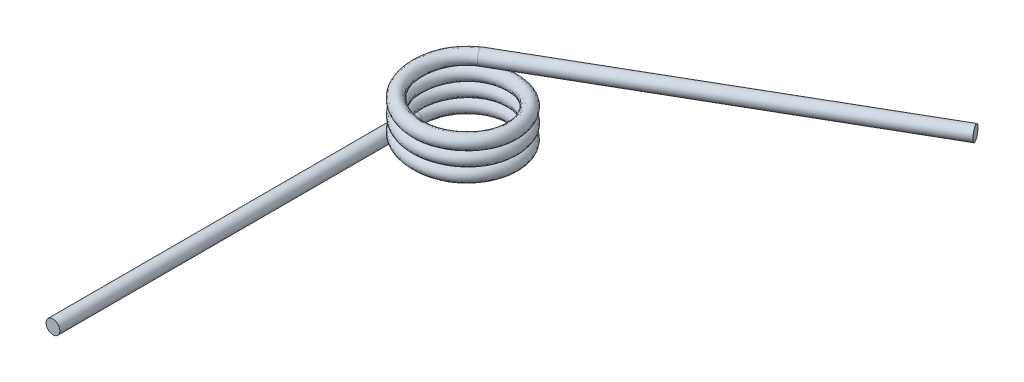
ISO-10303-21;
HEADER;
FILE_DESCRIPTION(('STEP AP214'),'2;1');
FILE_NAME('part.step','',(''),(''),'','','');
FILE_SCHEMA(('AUTOMOTIVE_DESIGN { 1 0 10303 214 1 1 1 1 }'));
ENDSEC;
DATA;
#1=APPLICATION_CONTEXT('core data for automotive mechanical design processes');
#2=APPLICATION_PROTOCOL_DEFINITION('international standard','automotive_design',2000,#1);
#3=PRODUCT_CONTEXT('',#1,'mechanical');
#4=PRODUCT('Part','Part','',(#3));
#5=PRODUCT_RELATED_PRODUCT_CATEGORY('part','',(#4));
#6=PRODUCT_DEFINITION_FORMATION('','',#4);
#7=PRODUCT_DEFINITION_CONTEXT('part definition',#1,'design');
#8=PRODUCT_DEFINITION('design','',#6,#7);
#9=PRODUCT_DEFINITION_SHAPE('','',#8);
#10=(LENGTH_UNIT() NAMED_UNIT(*) SI_UNIT(.MILLI.,.METRE.));
#11=(NAMED_UNIT(*) PLANE_ANGLE_UNIT() SI_UNIT($,.RADIAN.));
#12=(NAMED_UNIT(*) SI_UNIT($,.STERADIAN.) SOLID_ANGLE_UNIT());
#13=UNCERTAINTY_MEASURE_WITH_UNIT(LENGTH_MEASURE(1.E-05),#10,'distance_accuracy_value','');
#14=(GEOMETRIC_REPRESENTATION_CONTEXT(3) GLOBAL_UNCERTAINTY_ASSIGNED_CONTEXT((#13)) GLOBAL_UNIT_ASSIGNED_CONTEXT((#10,
#11,#12)) REPRESENTATION_CONTEXT('',''));
#15=CARTESIAN_POINT('',(0.,0.,0.));
#16=DIRECTION('',(0.,0.,1.));
#17=DIRECTION('',(1.,0.,0.));
#18=AXIS2_PLACEMENT_3D('',#15,#16,#17);
#19=CARTESIAN_POINT('',(31.2249907475932,4.75,-23.9167295593006));
#20=DIRECTION('',(-0.86602540378444,0.,0.499999999999998));
#21=DIRECTION('',(0.499999999999998,0.,0.86602540378444));
#22=AXIS2_PLACEMENT_3D('',#19,#20,#21);
#23=PLANE('',#22);
#24=CARTESIAN_POINT('',(31.2249907475932,4.75,-23.9167295593006));
#25=DIRECTION('',(-0.86602540378444,0.,0.499999999999998));
#26=DIRECTION('',(0.499999999999998,0.,0.86602540378444));
#27=AXIS2_PLACEMENT_3D('',#24,#25,#26);
#28=CIRCLE('',#27,0.745000000000001);
#29=CARTESIAN_POINT('',(31.5974907475932,4.75,-23.2715406334812));
#30=VERTEX_POINT('',#29);
#31=EDGE_CURVE('E74',#30,#30,#28,.T.);
#32=ORIENTED_EDGE('',*,*,#31,.F.);
#33=EDGE_LOOP('',(#32));
#34=FACE_BOUND('',#33,.T.);
#35=ADVANCED_FACE('F59',(#34),#23,.F.);
#36=CARTESIAN_POINT('',(-5.10000000000001,0.,39.));
#37=DIRECTION('',(0.,0.,1.));
#38=DIRECTION('',(0.999999993495773,0.000114054609235302,0.));
#39=AXIS2_PLACEMENT_3D('',#36,#37,#38);
#40=PLANE('',#39);
#41=CARTESIAN_POINT('',(-5.10000000000001,0.,39.));
#42=DIRECTION('',(0.,0.,1.));
#43=DIRECTION('',(0.999999993495773,0.000114054609235302,0.));
#44=AXIS2_PLACEMENT_3D('',#41,#42,#43);
#45=CIRCLE('',#44,0.745000000000001);
#46=CARTESIAN_POINT('',(-4.35500000484565,8.49706838837695E-05,39.));
#47=VERTEX_POINT('',#46);
#48=EDGE_CURVE('E68',#47,#47,#45,.T.);
#49=ORIENTED_EDGE('',*,*,#48,.T.);
#50=EDGE_LOOP('',(#49));
#51=FACE_BOUND('',#50,.T.);
#52=ADVANCED_FACE('F150',(#51),#40,.T.);
#53=CARTESIAN_POINT('',(-2.54999999999986,4.75,-4.41672955930073));
#54=DIRECTION('',(0.86602540378444,0.,-0.499999999999998));
#55=DIRECTION('',(-0.499999999999998,0.,-0.86602540378444));
#56=AXIS2_PLACEMENT_3D('',#53,#54,#55);
#57=CYLINDRICAL_SURFACE('',#56,0.745000000000001);
#58=ORIENTED_EDGE('',*,*,#31,.T.);
#59=EDGE_LOOP('',(#58));
#60=FACE_BOUND('',#59,.T.);
#61=CARTESIAN_POINT('',(-2.54999999999986,4.75,-4.41672955930072));
#62=DIRECTION('',(-0.865078141904125,-0.0467590761205418,0.49945309809837));
#63=DIRECTION('',(0.499999999999971,0.,0.866025403784455));
#64=AXIS2_PLACEMENT_3D('',#61,#62,#63);
#65=CIRCLE('',#64,0.745000000000001);
#66=CARTESIAN_POINT('',(-2.17749999999988,4.75,-3.77154063348131));
#67=VERTEX_POINT('',#66);
#68=EDGE_CURVE('E62',#67,#67,#65,.T.);
#69=ORIENTED_EDGE('',*,*,#68,.F.);
#70=EDGE_LOOP('',(#69));
#71=FACE_BOUND('',#70,.T.);
#72=ADVANCED_FACE('F112',(#60,#71),#57,.T.);
#73=CARTESIAN_POINT('',(-4.35500000484566,8.4877742623831E-05,3.97315071815063E-06));
#74=CARTESIAN_POINT('',(-4.35500049170202,0.0318251134411877,-0.580614354438543));
#75=CARTESIAN_POINT('',(-4.23649721866778,0.063729367407448,-1.15898934681182));
#76=CARTESIAN_POINT('',(-3.34382063298611,0.189542885597735,-3.28676576476937));
#77=CARTESIAN_POINT('',(-1.64198350085021,0.285312357409099,-4.39030935080915));
#78=CARTESIAN_POINT('',(1.82038378485511,0.474574749289196,-4.31786427379338));
#79=CARTESIAN_POINT('',(3.47975661831981,0.570680960795654,-3.13679904669797));
#80=CARTESIAN_POINT('',(4.6839424903672,0.759399147763516,0.100663864274794));
#81=CARTESIAN_POINT('',(4.19578314370466,0.855808187502097,2.08224169545152));
#82=CARTESIAN_POINT('',(1.63240436818566,1.04427251357359,4.39049577210398));
#83=CARTESIAN_POINT('',(-0.393091437395059,1.14090778587485,4.66687505817929));
#84=CARTESIAN_POINT('',(-3.28620030909251,1.31737576799788,3.23081301512258));
#85=CARTESIAN_POINT('',(-4.24568962950082,1.40117141018875,1.79832159252085));
#86=CARTESIAN_POINT('',(-4.46414136402237,1.58364356683938,-1.51850371389457));
#87=CARTESIAN_POINT('',(-3.33398435375743,1.68231651922826,-3.33163819513206));
#88=CARTESIAN_POINT('',(0.00172474381694135,1.88037268477069,-4.71531052251249));
#89=CARTESIAN_POINT('',(2.08468449364732,1.97945582915349,-4.22659895091506));
#90=CARTESIAN_POINT('',(4.46420956670509,2.17696977865345,-1.51568252556366));
#91=CARTESIAN_POINT('',(4.67193967777642,2.27665500806439,0.617961506534757));
#92=CARTESIAN_POINT('',(2.90720385488493,2.46948952573049,3.67457675764206));
#93=CARTESIAN_POINT('',(1.07004084216657,2.56581083547879,4.56023571166635));
#94=CARTESIAN_POINT('',(-2.34230030936542,2.75426742698741,4.05634457904224));
#95=CARTESIAN_POINT('',(-3.84659862477311,2.85093068165208,2.67149936493476));
#96=CARTESIAN_POINT('',(-4.63326245470203,3.039151741324,-0.682515674619303));
#97=CARTESIAN_POINT('',(-3.89952833681768,3.13595758715839,-2.59332510242046));
#98=CARTESIAN_POINT('',(-1.07137739662564,3.3241281359151,-4.55889107358654));
#99=CARTESIAN_POINT('',(0.974999867533546,3.42091086631926,-4.5808468289081));
#100=CARTESIAN_POINT('',(3.84508417751437,3.60917709184034,-2.67386817721572));
#101=CARTESIAN_POINT('',(4.61848238139732,3.70581236414485,-0.781548440294886));
#102=CARTESIAN_POINT('',(3.90116810590661,3.8942766902123,2.59253037609087));
#103=CARTESIAN_POINT('',(2.42915237050127,3.99068572995327,4.00607907497628));
#104=CARTESIAN_POINT('',(-0.97666517729352,4.17940391691991,4.58195800797555));
#105=CARTESIAN_POINT('',(-2.82918487864243,4.27551012841177,3.73543333767367));
#106=CARTESIAN_POINT('',(-4.62311044298779,4.46477252033562,0.773159450934701));
#107=CARTESIAN_POINT('',(-4.51833416186937,4.56054199214867,-1.25244664888496));
#108=CARTESIAN_POINT('',(-3.12196563467214,4.68635551025648,-3.0894166834495));
#109=CARTESIAN_POINT('',(-2.68033020665044,4.71825976418374,-3.48123144049018));
#110=CARTESIAN_POINT('',(-2.17749999999989,4.75,-3.77154063348131));
#111=CARTESIAN_POINT('',(-4.3550444953917,0.38973929085154,0.0182438043106747));
#112=CARTESIAN_POINT('',(-4.3574306773005,0.421479017671261,-0.562370637803314));
#113=CARTESIAN_POINT('',(-4.24143373838931,0.453383421192855,-1.14127095934507));
#114=CARTESIAN_POINT('',(-3.35732175797539,0.579197318637322,-3.27265354469486));
#115=CARTESIAN_POINT('',(-1.66037831683068,0.674966753419761,-4.38361648446119));
#116=CARTESIAN_POINT('',(1.80230383102391,0.864228999832589,-4.32536030468173));
#117=CARTESIAN_POINT('',(3.46679615786637,0.960335234595801,-3.15145140883677));
#118=CARTESIAN_POINT('',(4.68422639277113,1.14905345994167,0.0811043425544822));
#119=CARTESIAN_POINT('',(4.20464174518784,1.24546246580037,2.06480433178418));
#120=CARTESIAN_POINT('',(1.65068884393225,1.43392682339603,4.3835528539704));
#121=CARTESIAN_POINT('',(-0.373620759624214,1.53056206393764,4.66869917807277));
#122=CARTESIAN_POINT('',(-3.27261714852066,1.70703007601791,3.2444604959463));
#123=CARTESIAN_POINT('',(-4.23812742948987,1.79082613925565,1.81611002307953));
#124=CARTESIAN_POINT('',(-4.4706084694056,1.97329766548903,-1.49980823635831));
#125=CARTESIAN_POINT('',(-3.34795401276403,2.07197143910668,-3.31768534042661));
#126=CARTESIAN_POINT('',(-0.0180403796332627,2.27002653825817,-4.71537739474777));
#127=CARTESIAN_POINT('',(2.06704907975083,2.36911060368314,-4.23540387823056));
#128=CARTESIAN_POINT('',(4.45784688677571,2.56662365282058,-1.53435744287542));
#129=CARTESIAN_POINT('',(4.6747074005595,2.66630928507762,0.598484136233415));
#130=CARTESIAN_POINT('',(2.92246185337478,2.85914383612168,3.66233179745202));
#131=CARTESIAN_POINT('',(1.08912348397895,2.95546511320492,4.55594663460747));
#132=CARTESIAN_POINT('',(-2.3252959441487,3.14392173734658,4.06600699417536));
#133=CARTESIAN_POINT('',(-3.83559468256182,3.24058495935131,2.68766510414871));
#134=CARTESIAN_POINT('',(-4.63597819024973,3.42880605171079,-0.663150434851775));
#135=CARTESIAN_POINT('',(-3.91050923386143,3.5256118647574,-2.57714451170451));
#136=CARTESIAN_POINT('',(-1.09038141669799,3.71378244640268,-4.55428586189826));
#137=CARTESIAN_POINT('',(0.955911186190963,3.81056514375629,-4.58509727078069));
#138=CARTESIAN_POINT('',(3.83380861711362,3.99883140249007,-2.68984538124814));
#139=CARTESIAN_POINT('',(4.61540012710842,4.09546664134996,-0.800862976099092));
#140=CARTESIAN_POINT('',(3.91187980144788,4.28393100113013,2.57616667756522));
#141=CARTESIAN_POINT('',(2.44597455270861,4.38034000938844,3.99609432698432));
#142=CARTESIAN_POINT('',(-0.95750588145527,4.56905822342076,4.58590277047718));
#143=CARTESIAN_POINT('',(-2.81368190912862,4.66516434884167,3.74738141755824));
#144=CARTESIAN_POINT('',(-4.61975659764474,4.85442694762664,0.792443928115588));
#145=CARTESIAN_POINT('',(-4.52385147960822,4.95019637584874,-1.2337107799021));
#146=CARTESIAN_POINT('',(-3.13487375476189,5.07600957814852,-3.07631401487484));
#147=CARTESIAN_POINT('',(-2.69494216834125,5.10791365766567,-3.47004045707954));
#148=CARTESIAN_POINT('',(-2.19329615724789,5.13965441564331,-3.76242071784201));
#149=CARTESIAN_POINT('',(-4.71000388540033,0.74422955320838,0.0348375918200958));
#150=CARTESIAN_POINT('',(-4.71455967713253,0.776075123285141,-0.594473174597862));
#151=CARTESIAN_POINT('',(-4.59163304718302,0.807781040852514,-1.21853993434564));
#152=CARTESIAN_POINT('',(-3.64119863483831,0.934101416256235,-3.52986305417131));
#153=CARTESIAN_POINT('',(-1.81309820877475,1.02922768950069,-4.73536929162904));
#154=CARTESIAN_POINT('',(1.93640113694846,1.21897955229465,-4.68402671420544));
#155=CARTESIAN_POINT('',(3.73781945985087,1.3145847279768,-3.42250394913862));
#156=CARTESIAN_POINT('',(5.06698587987142,1.50382504584378,0.073595135272259));
#157=CARTESIAN_POINT('',(4.5562930567729,1.59971260049839,2.21715158774708));
#158=CARTESIAN_POINT('',(1.79871144232021,1.78869741486976,4.73653229137578));
#159=CARTESIAN_POINT('',(-0.3859570754249,1.88481246259036,5.0516798270641));
#160=CARTESIAN_POINT('',(-3.52981044259895,2.06176782940759,3.51931634967181));
#161=CARTESIAN_POINT('',(-4.57732636628793,2.1454155726667,1.97819271011646));
#162=CARTESIAN_POINT('',(-4.84025928792386,2.32768000475887,-1.60547371382181));
#163=CARTESIAN_POINT('',(-3.63231693014202,2.42649103322875,-3.57655020059201));
#164=CARTESIAN_POINT('',(-0.0363415266428423,2.6244781554662,-5.09954733878323));
#165=CARTESIAN_POINT('',(2.22024333216342,2.7235041443518,-4.58862591388376));
#166=CARTESIAN_POINT('',(4.81629870354265,2.92120768729321,-1.67439859419247));
#167=CARTESIAN_POINT('',(5.05913211866519,3.02054793186109,0.629119630122376));
#168=CARTESIAN_POINT('',(3.17215984485344,3.21391505086623,3.95258351228918));
#169=CARTESIAN_POINT('',(1.19588447681013,3.30971523754061,4.92401349945209));
#170=CARTESIAN_POINT('',(-2.50291005335415,3.49869233866161,4.40505321815508));
#171=CARTESIAN_POINT('',(-4.13856316956631,3.59483541492575,2.92224861443001));
#172=CARTESIAN_POINT('',(-5.01655131330705,3.7835763332775,-0.703311890226331));
#173=CARTESIAN_POINT('',(-4.24011786905383,3.87986239603597,-2.77250724674309));
#174=CARTESIAN_POINT('',(-1.19316630797024,4.06855266137943,-4.92289554942145));
#175=CARTESIAN_POINT('',(1.0161580276061,4.16481555030268,-4.96351542009352));
#176=CARTESIAN_POINT('',(4.13875830423228,4.35360174832534,-2.92106691394328));
#177=CARTESIAN_POINT('',(4.98944909100381,4.4497167928321,-0.884298869044787));
#178=CARTESIAN_POINT('',(4.23909700445409,4.63870161138185,2.77473204574996));
#179=CARTESIAN_POINT('',(2.66143819701573,4.73458917061701,4.31312278164007));
#180=CARTESIAN_POINT('',(-1.02186074916009,4.92382946687584,4.96327742408375));
#181=CARTESIAN_POINT('',(-3.0290118780021,5.01943443375035,4.06455226657031));
#182=CARTESIAN_POINT('',(-4.99459760573741,5.20918696946636,0.87114437221762));
#183=CARTESIAN_POINT('',(-4.8985371209887,5.30431323017871,-1.31684712085486));
#184=CARTESIAN_POINT('',(-3.40034917397227,5.43063227806782,-3.31709039507403));
#185=CARTESIAN_POINT('',(-2.92787544230098,5.46233748830618,-3.74287570170657));
#186=CARTESIAN_POINT('',(-2.38512789418403,5.49418511616661,-4.06149167185719));
#187=CARTESIAN_POINT('',(-5.49016605596745,0.744140669444154,0.0348334311464499));
#188=CARTESIAN_POINT('',(-5.49472007089267,0.776222162641322,-0.701527246462671));
#189=CARTESIAN_POINT('',(-5.35154782484295,0.807489233928933,-1.42382489031075));
#190=CARTESIAN_POINT('',(-4.23819807728199,0.934922161312581,-4.12347052582096));
#191=CARTESIAN_POINT('',(-2.11200858904863,1.02863474820489,-5.52195765151017));
#192=CARTESIAN_POINT('',(2.26732596793801,1.21946314828396,-5.4574343594456));
#193=CARTESIAN_POINT('',(4.35948809007298,1.31396687842377,-3.9890112041721));
#194=CARTESIAN_POINT('',(5.90777778839171,1.50435475305072,0.0962078746411478));
#195=CARTESIAN_POINT('',(5.31155537925926,1.59909615165868,2.58690722051508));
#196=CARTESIAN_POINT('',(2.08751718471482,1.78922494088962,5.52631706227848));
#197=CARTESIAN_POINT('',(-0.452015405116702,1.88419659443169,5.889877445848));
#198=CARTESIAN_POINT('',(-4.12232415152492,2.06222317625975,4.09619359038129));
#199=CARTESIAN_POINT('',(-5.33805820345847,2.14554404904724,2.29889661459002));
#200=CARTESIAN_POINT('',(-5.63987007520941,2.32735451964162,-1.87513239529861));
#201=CARTESIAN_POINT('',(-4.22944769062727,2.42646561131303,-4.17347763743608));
#202=CARTESIAN_POINT('',(-0.0370398000456911,2.62430544341754,-5.94387369228625));
#203=CARTESIAN_POINT('',(2.59225688388097,2.72320192973877,-5.34744825929847));
#204=CARTESIAN_POINT('',(5.61695206507592,2.92132600584084,-1.94487909923312));
#205=CARTESIAN_POINT('',(5.89861680067396,3.01990623351941,0.735415537240408));
#206=CARTESIAN_POINT('',(3.69051549601561,3.21444394579059,4.61508792431861));
#207=CARTESIAN_POINT('',(1.39239501795263,3.30909876707092,5.74165489646585));
#208=CARTESIAN_POINT('',(-2.92733982112221,3.49921988523695,5.13100014059636));
#209=CARTESIAN_POINT('',(-4.82653881694232,3.59421967261314,3.40556500787036));
#210=CARTESIAN_POINT('',(-5.84767361684803,3.78410317695192,-0.830322952528635));
#211=CARTESIAN_POINT('',(-4.94268266712284,3.87924682034216,-3.23430346579109));
#212=CARTESIAN_POINT('',(-1.3810940566919,4.06907935846817,-5.74236241706422));
#213=CARTESIAN_POINT('',(1.18676650415785,4.16419970074109,-5.78683137264625));
#214=CARTESIAN_POINT('',(4.83163214721448,4.35412873274812,-3.39737027352977));
#215=CARTESIAN_POINT('',(5.8178263458018,4.44910038307459,-1.02907373993563));
#216=CARTESIAN_POINT('',(4.93694349797091,4.63922917648565,3.24393432291675));
#217=CARTESIAN_POINT('',(3.10141352357758,4.7339705796753,5.02996584630294));
#218=CARTESIAN_POINT('',(-1.20164047990981,4.92435843269058,5.78491098361934));
#219=CARTESIAN_POINT('',(-3.53334367041954,5.01886195403862,4.73784267848973));
#220=CARTESIAN_POINT('',(-5.82525906829582,5.20969102699756,1.00557017128616));
#221=CARTESIAN_POINT('',(-5.7111147392635,5.30340360135565,-1.53706434347829));
#222=CARTESIAN_POINT('',(-3.95808560885122,5.4308352013091,-3.87255641171183));
#223=CARTESIAN_POINT('',(-3.41067090913251,5.46210148617539,-4.36498870104154));
#224=CARTESIAN_POINT('',(-2.77520898200474,5.49418511616661,-4.73713193503445));
#225=CARTESIAN_POINT('',(-5.8450444857004,0.389569535366293,0.0182358580093356));
#226=CARTESIAN_POINT('',(-5.84742837548999,0.421759613452854,-0.766831884058172));
#227=CARTESIAN_POINT('',(-5.69276405670763,0.452826111021069,-1.53333634515929));
#228=CARTESIAN_POINT('',(-4.49750670543015,0.580764826230128,-4.40636030511692));
#229=CARTESIAN_POINT('',(-2.23125509157419,0.673834318962161,-5.88588959229558));
#230=CARTESIAN_POINT('',(2.43432370274869,0.865152600137799,-5.80246010187127));
#231=CARTESIAN_POINT('',(4.65409578345183,0.959155228872061,-4.23340056806802));
#232=CARTESIAN_POINT('',(6.29002065299791,1.1500651261845,0.124291493522663));
#233=CARTESIAN_POINT('',(5.6470865286454,1.24428513524018,2.77098557207351));
#234=CARTESIAN_POINT('',(2.20226718187703,1.43493432388024,5.89193065718865));
#235=CARTESIAN_POINT('',(-0.499782876054811,1.52938584239884,6.26953870988398));
#236=CARTESIAN_POINT('',(-4.40423497602712,1.70789972444415,4.34621486893682));
#237=CARTESIAN_POINT('',(-5.69101821652968,1.79107151107028,2.42860936305028));
#238=CARTESIAN_POINT('',(-5.99775258155524,1.97267603470259,-2.01481838159142));
#239=CARTESIAN_POINT('',(-4.48838975921415,2.07192288682391,-4.45773276731291));
#240=CARTESIAN_POINT('',(-0.0193739835888567,2.26969668254302,-6.32792194766549));
#241=CARTESIAN_POINT('',(2.77754262758176,2.36853341628822,-5.68464780464523));
#242=CARTESIAN_POINT('',(5.986982169075,2.56684962460162,-2.0509371555233));
#243=CARTESIAN_POINT('',(6.27800504205816,2.66508373152182,0.801494364822459));
#244=CARTESIAN_POINT('',(3.91244822332048,2.86015395101995,4.92762202137868));
#245=CARTESIAN_POINT('',(1.46443097188663,2.95428774133513,6.11752667474606));
#246=CARTESIAN_POINT('',(-3.13589709057404,3.14492927708825,5.45246348771893));
#247=CARTESIAN_POINT('',(-5.14953138263919,3.23940897815705,3.61073142126901));
#248=CARTESIAN_POINT('',(-6.22330486532286,3.42981224901263,-0.905723695564699));
#249=CARTESIAN_POINT('',(-5.25230915933328,3.52443620177992,-3.45911032326637));
#250=CARTESIAN_POINT('',(-1.44929697852486,3.71478836374818,-6.11935229411259));
#251=CARTESIAN_POINT('',(1.28174937471045,3.80938895773433,-6.15751491367811));
#252=CARTESIAN_POINT('',(5.15710018170955,3.9998378685987,-3.59951779032644));
#253=CARTESIAN_POINT('',(6.19748414526889,4.0942893854303,-1.07736261216801));
#254=CARTESIAN_POINT('',(5.24466842898991,4.28493857626012,3.47227701823376));
#255=CARTESIAN_POINT('',(3.28626552944709,4.37915858771501,5.36516373293215));
#256=CARTESIAN_POINT('',(-1.30085987526286,4.5700684737104,6.15510727939953));
#257=CARTESIAN_POINT('',(-3.77688468179442,4.66407099313385,5.03327138387856));
#258=CARTESIAN_POINT('',(-6.20620313126388,4.85538962659549,1.04917829292555));
#259=CARTESIAN_POINT('',(-6.07576041475512,4.94845911276462,-1.65429469433162));
#260=CARTESIAN_POINT('',(-4.20007188139795,5.07639713299196,-4.1371759620793));
#261=CARTESIAN_POINT('',(-3.61701046162491,5.10746321600436,-4.65818931324847));
#262=CARTESIAN_POINT('',(-2.93829615724785,5.13965441564331,-5.05279856948085));
#263=CARTESIAN_POINT('',(-5.84495550460832,-0.389739290851539,-0.0182438043105776));
#264=CARTESIAN_POINT('',(-5.84257049690338,-0.357548104664238,-0.803326159150884));
#265=CARTESIAN_POINT('',(-5.68289101726457,-0.326481996549745,-1.56877312009281));
#266=CARTESIAN_POINT('',(-4.47050445545159,-0.198544039849048,-4.43458474526594));
#267=CARTESIAN_POINT('',(-2.1944654596203,-0.105474473059162,-5.89927532499151));
#268=CARTESIAN_POINT('',(2.47048361041811,0.0858440990510125,-5.78746804009457));
#269=CARTESIAN_POINT('',(4.6800167043587,0.179846681271766,-4.20409584378341));
#270=CARTESIAN_POINT('',(6.28945284819005,0.370756501828188,0.163410536956268));
#271=CARTESIAN_POINT('',(5.62936932567553,0.464976578644515,2.8058602994117));
#272=CARTESIAN_POINT('',(2.16569823038737,0.655625704234467,5.90581649345231));
#273=CARTESIAN_POINT('',(-0.538724231603514,0.750077286272374,6.26589047009702));
#274=CARTESIAN_POINT('',(-4.43140129716467,0.928591108404852,4.31891990728938));
#275=CARTESIAN_POINT('',(-5.70614261655158,1.01176205293648,2.39303250193291));
#276=CARTESIAN_POINT('',(-5.98481837078877,1.1933678374033,-2.05220933666393));
#277=CARTESIAN_POINT('',(-4.46045044120096,1.29261304706799,-4.48563847672382));
#278=CARTESIAN_POINT('',(0.0201562633115513,1.49038897556715,-6.32778820319493));
#279=CARTESIAN_POINT('',(2.81281345537474,1.5892238672289,-5.66703795001055));
#280=CARTESIAN_POINT('',(5.99970752893375,1.78754187626737,-2.01358732090347));
#281=CARTESIAN_POINT('',(6.27246959649201,1.88577517749537,0.840449105439825));
#282=CARTESIAN_POINT('',(3.88193222634078,2.08084533023758,4.95211194174467));
#283=CARTESIAN_POINT('',(1.42626568826186,2.17497918588376,6.12610482886382));
#284=CARTESIAN_POINT('',(-3.1699058210075,2.36562065636901,5.4331386574527));
#285=CARTESIAN_POINT('',(-5.17153926706177,2.46010042275859,3.5783999428411));
#286=CARTESIAN_POINT('',(-6.21787339422747,2.65050362823905,-0.944454175099754));
#287=CARTESIAN_POINT('',(-5.23034736524928,2.74512764658189,-3.49147150469477));
#288=CARTESIAN_POINT('',(-1.41128893837667,2.93547974277301,-6.12856271749266));
#289=CARTESIAN_POINT('',(1.31992673740963,3.03008040286028,-6.14901402993292));
#290=CARTESIAN_POINT('',(5.17965130249703,3.22052924729923,-3.56756338226161));
#291=CARTESIAN_POINT('',(6.20364865384668,3.31498083102007,-1.03873354056661));
#292=CARTESIAN_POINT('',(5.22324503790736,3.50562995442446,3.50500441529208));
#293=CARTESIAN_POINT('',(3.2526211650324,3.5998500288438,5.38513322891607));
#294=CARTESIAN_POINT('',(-1.33917846693936,3.79075986070957,6.14721775439627));
#295=CARTESIAN_POINT('',(-3.80789062082205,3.88476255227316,5.0093752241024));
#296=CARTESIAN_POINT('',(-6.21291082194997,4.07608077201432,1.01060933857082));
#297=CARTESIAN_POINT('',(-6.06472577927037,4.16915034536447,-1.69176643229733));
#298=CARTESIAN_POINT('',(-4.17425564122078,4.29708899720787,-4.16338129922862));
#299=CARTESIAN_POINT('',(-3.58777936676728,4.32815551996298,-4.68057254225208));
#300=CARTESIAN_POINT('',(-2.90670384275184,4.36034558435668,-5.07103840075944));
#301=CARTESIAN_POINT('',(-5.48999611459968,-0.744229553208377,-0.0348375918199986));
#302=CARTESIAN_POINT('',(-5.48544131159616,-0.712145948986993,-0.771223722031593));
#303=CARTESIAN_POINT('',(-5.33269170847203,-0.680879616209112,-1.49150414509224));
#304=CARTESIAN_POINT('',(-4.18662757858514,-0.55344813746884,-4.1773752357895));
#305=CARTESIAN_POINT('',(-2.04174556767622,-0.459735409140091,-5.54752251782014));
#306=CARTESIAN_POINT('',(2.33638630449356,-0.268906453411049,-5.42880163057437));
#307=CARTESIAN_POINT('',(4.4089934023742,-0.174402812108357,-3.93304330348155));
#308=CARTESIAN_POINT('',(5.90669336108976,0.0159849159252,0.170919744238498));
#309=CARTESIAN_POINT('',(5.27771801409046,0.110726443946497,2.6535130434488));
#310=CARTESIAN_POINT('',(2.01767563199941,0.300855112760742,5.55283705604693));
#311=CARTESIAN_POINT('',(-0.526387915809839,0.395826887617899,5.88290982110043));
#312=CARTESIAN_POINT('',(-4.17420800308025,0.573853355016706,4.04406405356847));
#313=CARTESIAN_POINT('',(-5.36694367975506,0.657172619523113,2.23094981489598));
#314=CARTESIAN_POINT('',(-5.61516755226868,0.83898549813621,-1.94654385920044));
#315=CARTESIAN_POINT('',(-4.17608752382297,0.938093452944998,-4.22677361655108));
#316=CARTESIAN_POINT('',(0.0384574103211239,1.13593735836004,-5.94361825916682));
#317=CARTESIAN_POINT('',(2.65961920296215,1.23483032656025,-5.31381591434634));
#318=CARTESIAN_POINT('',(5.64125571216682,1.43295784179474,-1.87354616959743));
#319=CARTESIAN_POINT('',(5.88804487838447,1.53153653071374,0.809813611543523));
#320=CARTESIAN_POINT('',(3.63223423486388,1.72607411549126,4.66186022691455));
#321=CARTESIAN_POINT('',(1.31950469543069,1.82072906154631,5.75803796402974));
#322=CARTESIAN_POINT('',(-2.99229171180204,2.01085005505575,5.09409243346243));
#323=CARTESIAN_POINT('',(-4.86857078005728,2.10584996718592,3.3438164325598));
#324=CARTESIAN_POINT('',(-5.83730027117015,2.29573334667058,-0.904292719725198));
#325=CARTESIAN_POINT('',(-4.9007387300639,2.39087711530025,-3.2961087696562));
#326=CARTESIAN_POINT('',(-1.3085040470974,2.58070952779933,-5.75995302996948));
#327=CARTESIAN_POINT('',(1.25967989598047,2.67582999631608,-5.77059588062359));
#328=CARTESIAN_POINT('',(4.87470161539239,2.86575890146176,-3.33634184956295));
#329=CARTESIAN_POINT('',(5.82959968994427,2.96073067953706,-0.95529764762092));
#330=CARTESIAN_POINT('',(4.89602783490816,3.15085934417361,3.30643904710734));
#331=CARTESIAN_POINT('',(3.0371575207253,3.24560086761698,5.06810477426733));
#332=CARTESIAN_POINT('',(-1.27482359923453,3.43598861725274,5.76984310078269));
#333=CARTESIAN_POINT('',(-3.59256065195559,3.53049246736449,4.69220437509385));
#334=CARTESIAN_POINT('',(-5.83806981385027,3.72132075017461,0.931908894465275));
#335=CARTESIAN_POINT('',(-5.69004013787932,3.81503349103714,-1.60863009135162));
#336=CARTESIAN_POINT('',(-3.9087802220139,3.9424662972877,-3.9226049190271));
#337=CARTESIAN_POINT('',(-3.35484620429879,3.97373341652445,-4.40773706641226));
#338=CARTESIAN_POINT('',(-2.7148721058157,4.00581488383338,-4.77196744674426));
#339=CARTESIAN_POINT('',(-4.70983394403257,-0.744140669444151,-0.0348334311463527));
#340=CARTESIAN_POINT('',(-4.7052784658328,-0.712293067203565,-0.6641629197614));
#341=CARTESIAN_POINT('',(-4.5727769308121,-0.680587809285532,-1.28621918912713));
#342=CARTESIAN_POINT('',(-3.58962813614146,-0.554268882525187,-3.58376776413985));
#343=CARTESIAN_POINT('',(-1.74283518740235,-0.459142467843405,-4.76093415793901));
#344=CARTESIAN_POINT('',(2.00546147350401,-0.269390049401238,-4.65539398533421));
#345=CARTESIAN_POINT('',(3.78732477215561,-0.173784962555327,-3.36653604844807));
#346=CARTESIAN_POINT('',(5.06590145256597,0.0154552087182616,0.148307004869608));
#347=CARTESIAN_POINT('',(4.52245569160411,0.111342892786202,2.2837574106808));
#348=CARTESIAN_POINT('',(1.72886988960479,0.300327586740885,4.76305228514422));
#349=CARTESIAN_POINT('',(-0.460329586125051,0.39644275577657,5.04471220231652));
#350=CARTESIAN_POINT('',(-3.58169429414815,0.573398008164547,3.46718681285899));
#351=CARTESIAN_POINT('',(-4.60621184258451,0.65704414314258,1.91024591043475));
#352=CARTESIAN_POINT('',(-4.81555676498313,0.839310983253465,-1.67688517773832));
#353=CARTESIAN_POINT('',(-3.57895676334506,0.938118874859803,-3.62984617971067));
#354=CARTESIAN_POINT('',(0.0391556837313226,1.13611007040962,-5.09929190566013));
#355=CARTESIAN_POINT('',(2.28760565124827,1.23513254117328,-4.55499356893163));
#356=CARTESIAN_POINT('',(4.84060235062987,1.43283952324711,-1.60306566455678));
#357=CARTESIAN_POINT('',(5.04856019637571,1.53217822905449,0.703517704418157));
#358=CARTESIAN_POINT('',(3.11387858370171,1.72554522056778,3.99935581489218));
#359=CARTESIAN_POINT('',(1.12299415428819,1.82134553201512,4.94039656701599));
#360=CARTESIAN_POINT('',(-2.56786194403398,2.01032250848128,4.36814551102115));
#361=CARTESIAN_POINT('',(-4.18059513268127,2.10646570950028,2.86050003911945));
#362=CARTESIAN_POINT('',(-5.00617796762917,2.29520650299441,-0.777281657422895));
#363=CARTESIAN_POINT('',(-4.19817393199489,2.39149269099493,-2.83431255061171));
#364=CARTESIAN_POINT('',(-1.12057629837574,2.58018283070972,-4.94048616232319));
#365=CARTESIAN_POINT('',(1.08907141943573,2.67644584587767,-4.94727992807086));
#366=CARTESIAN_POINT('',(4.18182777240318,2.86523191703899,-2.86003848997646));
#367=CARTESIAN_POINT('',(5.00122243514629,2.96134708929545,-0.810522776730078));
#368=CARTESIAN_POINT('',(4.19818134139134,3.15033177906894,2.83723676994055));
#369=CARTESIAN_POINT('',(2.59718219416344,3.24621945855782,4.35126170960447));
#370=CARTESIAN_POINT('',(-1.09504386848481,3.43545965143887,4.94820954124709));
#371=CARTESIAN_POINT('',(-3.08822885953464,3.53106494707621,4.01891396317443));
#372=CARTESIAN_POINT('',(-5.00740835129537,3.72081669264341,0.797483095396734));
#373=CARTESIAN_POINT('',(-4.87746251960804,3.81594311986021,-1.38841286872115));
#374=CARTESIAN_POINT('',(-3.35104378713378,3.94226337404642,-3.36713890239164));
#375=CARTESIAN_POINT('',(-2.87205779215439,3.97396933923383,-3.7856228254406));
#376=CARTESIAN_POINT('',(-2.32479101799499,4.00581488383338,-4.096327183567));
#377=CARTESIAN_POINT('',(-4.35495551429962,-0.389569535366292,-0.0182358580092384));
#378=CARTESIAN_POINT('',(-4.35257030610354,-0.357828790788886,-0.598858071073773));
#379=CARTESIAN_POINT('',(-4.23156069894625,-0.325924686377959,-1.17670773427858));
#380=CARTESIAN_POINT('',(-3.33031950799682,-0.200111547441853,-3.30087798484388));
#381=CARTESIAN_POINT('',(-1.62358868486975,-0.104342038601562,-4.39700221715712));
#382=CARTESIAN_POINT('',(1.8384637386863,0.0849204987458024,-4.31036824290503));
#383=CARTESIAN_POINT('',(3.49271707877324,0.181026686995507,-3.12214668455917));
#384=CARTESIAN_POINT('',(4.68365858796327,0.369744835585361,0.120223385995105));
#385=CARTESIAN_POINT('',(4.18692454222148,0.466153909203829,2.09967905911886));
#386=CARTESIAN_POINT('',(1.61411989243908,0.654618203751142,4.39743869023757));
#387=CARTESIAN_POINT('',(-0.412562115165904,0.751253507812054,4.66505093828581));
#388=CARTESIAN_POINT('',(-3.29978346966435,0.927721459977843,3.21716553429886));
#389=CARTESIAN_POINT('',(-4.25325182951177,1.01151668112185,1.78053316196217));
#390=CARTESIAN_POINT('',(-4.45767425863913,1.19398946818974,-1.53719919143082));
#391=CARTESIAN_POINT('',(-3.32001469475084,1.29266159934983,-3.34559104983751));
#392=CARTESIAN_POINT('',(0.0214898672671454,1.49071883128322,-4.71524365027721));
#393=CARTESIAN_POINT('',(2.10231990754381,1.58980105462383,-4.21779402359955));
#394=CARTESIAN_POINT('',(4.47057224663446,1.78731590448633,-1.49700760825191));
#395=CARTESIAN_POINT('',(4.66917195499334,1.88700073105117,0.637438876836099));
#396=CARTESIAN_POINT('',(2.89194585639508,2.07983521533931,3.6868217178321));
#397=CARTESIAN_POINT('',(1.0509582003542,2.17615655775266,4.56452478872523));
#398=CARTESIAN_POINT('',(-2.35930467458214,2.36461311662823,4.04668216390913));
#399=CARTESIAN_POINT('',(-3.8576025669844,2.46127640395285,2.6553336257208));
#400=CARTESIAN_POINT('',(-4.63054671915433,2.6494974309372,-0.70188091438683));
#401=CARTESIAN_POINT('',(-3.88854743977393,2.74630330955937,-2.60950569313642));
#402=CARTESIAN_POINT('',(-1.0523733765533,2.93447382542751,-4.56349628527482));
#403=CARTESIAN_POINT('',(0.994088548876128,3.03125658888224,-4.5765963870355));
#404=CARTESIAN_POINT('',(3.85635973791513,3.2195227811906,-2.6578909731833));
#405=CARTESIAN_POINT('',(4.62156463568622,3.31615808693973,-0.76223390449068));
#406=CARTESIAN_POINT('',(3.89045641036534,3.50462237929448,2.60889407461652));
#407=CARTESIAN_POINT('',(2.41233018829393,3.6010314505181,4.01606382296824));
#408=CARTESIAN_POINT('',(-0.995824473131769,3.78974961041905,4.57801324547392));
#409=CARTESIAN_POINT('',(-2.84468784815624,3.88585590798186,3.72348525778911));
#410=CARTESIAN_POINT('',(-4.62646428833083,4.0751180930446,0.753874973753814));
#411=CARTESIAN_POINT('',(-4.51281684413052,4.1708876084486,-1.27118251786781));
#412=CARTESIAN_POINT('',(-3.10905751458238,4.29670144236443,-3.10251935202416));
#413=CARTESIAN_POINT('',(-2.66571824495963,4.32860587070181,-3.49242242390082));
#414=CARTESIAN_POINT('',(-2.16170384275189,4.36034558435668,-3.7806605491206));
#415=CARTESIAN_POINT('',(-4.35500000484566,8.4877742623831E-05,3.97315071815063E-06));
#416=CARTESIAN_POINT('',(-4.35500049170202,0.0318251134411877,-0.580614354438543));
#417=CARTESIAN_POINT('',(-4.23649721866778,0.063729367407448,-1.15898934681182));
#418=CARTESIAN_POINT('',(-3.34382063298611,0.189542885597735,-3.28676576476937));
#419=CARTESIAN_POINT('',(-1.64198350085021,0.285312357409099,-4.39030935080915));
#420=CARTESIAN_POINT('',(1.82038378485511,0.474574749289196,-4.31786427379338));
#421=CARTESIAN_POINT('',(3.47975661831981,0.570680960795654,-3.13679904669797));
#422=CARTESIAN_POINT('',(4.6839424903672,0.759399147763516,0.100663864274794));
#423=CARTESIAN_POINT('',(4.19578314370466,0.855808187502097,2.08224169545152));
#424=CARTESIAN_POINT('',(1.63240436818566,1.04427251357359,4.39049577210398));
#425=CARTESIAN_POINT('',(-0.393091437395059,1.14090778587485,4.66687505817929));
#426=CARTESIAN_POINT('',(-3.28620030909251,1.31737576799788,3.23081301512258));
#427=CARTESIAN_POINT('',(-4.24568962950082,1.40117141018875,1.79832159252085));
#428=CARTESIAN_POINT('',(-4.46414136402237,1.58364356683938,-1.51850371389457));
#429=CARTESIAN_POINT('',(-3.33398435375743,1.68231651922826,-3.33163819513206));
#430=CARTESIAN_POINT('',(0.00172474381694135,1.88037268477069,-4.71531052251249));
#431=CARTESIAN_POINT('',(2.08468449364732,1.97945582915349,-4.22659895091506));
#432=CARTESIAN_POINT('',(4.46420956670509,2.17696977865345,-1.51568252556366));
#433=CARTESIAN_POINT('',(4.67193967777642,2.27665500806439,0.617961506534757));
#434=CARTESIAN_POINT('',(2.90720385488493,2.46948952573049,3.67457675764206));
#435=CARTESIAN_POINT('',(1.07004084216657,2.56581083547879,4.56023571166635));
#436=CARTESIAN_POINT('',(-2.34230030936542,2.75426742698741,4.05634457904224));
#437=CARTESIAN_POINT('',(-3.84659862477311,2.85093068165208,2.67149936493476));
#438=CARTESIAN_POINT('',(-4.63326245470203,3.039151741324,-0.682515674619303));
#439=CARTESIAN_POINT('',(-3.89952833681768,3.13595758715839,-2.59332510242046));
#440=CARTESIAN_POINT('',(-1.07137739662564,3.3241281359151,-4.55889107358654));
#441=CARTESIAN_POINT('',(0.974999867533546,3.42091086631926,-4.5808468289081));
#442=CARTESIAN_POINT('',(3.84508417751437,3.60917709184034,-2.67386817721572));
#443=CARTESIAN_POINT('',(4.61848238139732,3.70581236414485,-0.781548440294886));
#444=CARTESIAN_POINT('',(3.90116810590661,3.8942766902123,2.59253037609087));
#445=CARTESIAN_POINT('',(2.42915237050127,3.99068572995327,4.00607907497628));
#446=CARTESIAN_POINT('',(-0.97666517729352,4.17940391691991,4.58195800797555));
#447=CARTESIAN_POINT('',(-2.82918487864243,4.27551012841177,3.73543333767367));
#448=CARTESIAN_POINT('',(-4.62311044298779,4.46477252033562,0.773159450934701));
#449=CARTESIAN_POINT('',(-4.51833416186937,4.56054199214867,-1.25244664888496));
#450=CARTESIAN_POINT('',(-3.12196563467214,4.68635551025648,-3.0894166834495));
#451=CARTESIAN_POINT('',(-2.68033020665044,4.71825976418374,-3.48123144049018));
#452=CARTESIAN_POINT('',(-2.17749999999989,4.75,-3.77154063348131));
#453=B_SPLINE_SURFACE_WITH_KNOTS('',3,3,((#73,#74,#75,#76,#77,#78,#79,#80,#81,#82,#83,#84,#85,
#86,#87,#88,#89,#90,#91,#92,#93,#94,#95,#96,#97,#98,#99,#100,#101,#102,#103,#104,#105,#106,#107,
#108,#109,#110),(#111,#112,#113,#114,#115,#116,#117,#118,#119,#120,#121,#122,#123,#124,#125,
#126,#127,#128,#129,#130,#131,#132,#133,#134,#135,#136,#137,#138,#139,#140,#141,#142,#143,#144,
#145,#146,#147,#148),(#149,#150,#151,#152,#153,#154,#155,#156,#157,#158,#159,#160,#161,#162,
#163,#164,#165,#166,#167,#168,#169,#170,#171,#172,#173,#174,#175,#176,#177,#178,#179,#180,#181,
#182,#183,#184,#185,#186),(#187,#188,#189,#190,#191,#192,#193,#194,#195,#196,#197,#198,#199,
#200,#201,#202,#203,#204,#205,#206,#207,#208,#209,#210,#211,#212,#213,#214,#215,#216,#217,#218,
#219,#220,#221,#222,#223,#224),(#225,#226,#227,#228,#229,#230,#231,#232,#233,#234,#235,#236,
#237,#238,#239,#240,#241,#242,#243,#244,#245,#246,#247,#248,#249,#250,#251,#252,#253,#254,#255,
#256,#257,#258,#259,#260,#261,#262),(#263,#264,#265,#266,#267,#268,#269,#270,#271,#272,#273,
#274,#275,#276,#277,#278,#279,#280,#281,#282,#283,#284,#285,#286,#287,#288,#289,#290,#291,#292,
#293,#294,#295,#296,#297,#298,#299,#300),(#301,#302,#303,#304,#305,#306,#307,#308,#309,#310,
#311,#312,#313,#314,#315,#316,#317,#318,#319,#320,#321,#322,#323,#324,#325,#326,#327,#328,#329,
#330,#331,#332,#333,#334,#335,#336,#337,#338),(#339,#340,#341,#342,#343,#344,#345,#346,#347,
#348,#349,#350,#351,#352,#353,#354,#355,#356,#357,#358,#359,#360,#361,#362,#363,#364,#365,#366,
#367,#368,#369,#370,#371,#372,#373,#374,#375,#376),(#377,#378,#379,#380,#381,#382,#383,#384,
#385,#386,#387,#388,#389,#390,#391,#392,#393,#394,#395,#396,#397,#398,#399,#400,#401,#402,#403,
#404,#405,#406,#407,#408,#409,#410,#411,#412,#413,#414),(#415,#416,#417,#418,#419,#420,#421,
#422,#423,#424,#425,#426,#427,#428,#429,#430,#431,#432,#433,#434,#435,#436,#437,#438,#439,#440,
#441,#442,#443,#444,#445,#446,#447,#448,#449,#450,#451,#452)),.UNSPECIFIED.,.T.,.F.,.F.,(4,2,2,
2,4),(4,2,2,2,2,2,2,2,2,2,2,2,2,2,2,2,2,2,4),(0.,0.25,0.5,0.75,1.),(0.,0.0199026246500761,
0.080038699427795,0.140037580886942,0.200033894979174,0.260027541621185,0.3125,0.375,0.4375,
0.500000000000001,0.559996921170641,0.61998963043539,0.679980774895382,0.739972458378816,
0.799966105020827,0.859962419113058,0.919961300572205,0.980097375349924,1.),.UNSPECIFIED.);
#454=CARTESIAN_POINT('',(-5.10000000000001,0.,0.));
#455=DIRECTION('',(0.,0.,1.));
#456=DIRECTION('',(0.999999993495773,0.000114054609235302,0.));
#457=AXIS2_PLACEMENT_3D('',#454,#455,#456);
#458=CIRCLE('',#457,0.745000000000001);
#459=CARTESIAN_POINT('',(-4.35500000484433,8.49126018504636E-05,1.98642263350317E-06));
#460=VERTEX_POINT('',#459);
#461=EDGE_CURVE('E12',#460,#460,#458,.T.);
#462=ORIENTED_EDGE('',*,*,#68,.T.);
#463=EDGE_LOOP('',(#462));
#464=FACE_BOUND('',#463,.T.);
#465=ORIENTED_EDGE('',*,*,#461,.F.);
#466=EDGE_LOOP('',(#465));
#467=FACE_BOUND('',#466,.T.);
#468=ADVANCED_FACE('F106',(#464,#467),#453,.F.);
#469=CARTESIAN_POINT('',(-5.10000000000001,0.,39.));
#470=DIRECTION('',(0.,0.,-1.));
#471=DIRECTION('',(-1.,0.,0.));
#472=AXIS2_PLACEMENT_3D('',#469,#470,#471);
#473=CYLINDRICAL_SURFACE('',#472,0.745000000000001);
#474=ORIENTED_EDGE('',*,*,#461,.T.);
#475=EDGE_LOOP('',(#474));
#476=FACE_BOUND('',#475,.T.);
#477=ORIENTED_EDGE('',*,*,#48,.F.);
#478=EDGE_LOOP('',(#477));
#479=FACE_BOUND('',#478,.T.);
#480=ADVANCED_FACE('F87',(#476,#479),#473,.T.);
#481=CLOSED_SHELL('',(#35,#52,#72,#468,#480));
#482=MANIFOLD_SOLID_BREP('B2',#481);
#483=ADVANCED_BREP_SHAPE_REPRESENTATION('',(#18,#482),#14);
#484=SHAPE_DEFINITION_REPRESENTATION(#9,#483);
ENDSEC;
END-ISO-10303-21;
